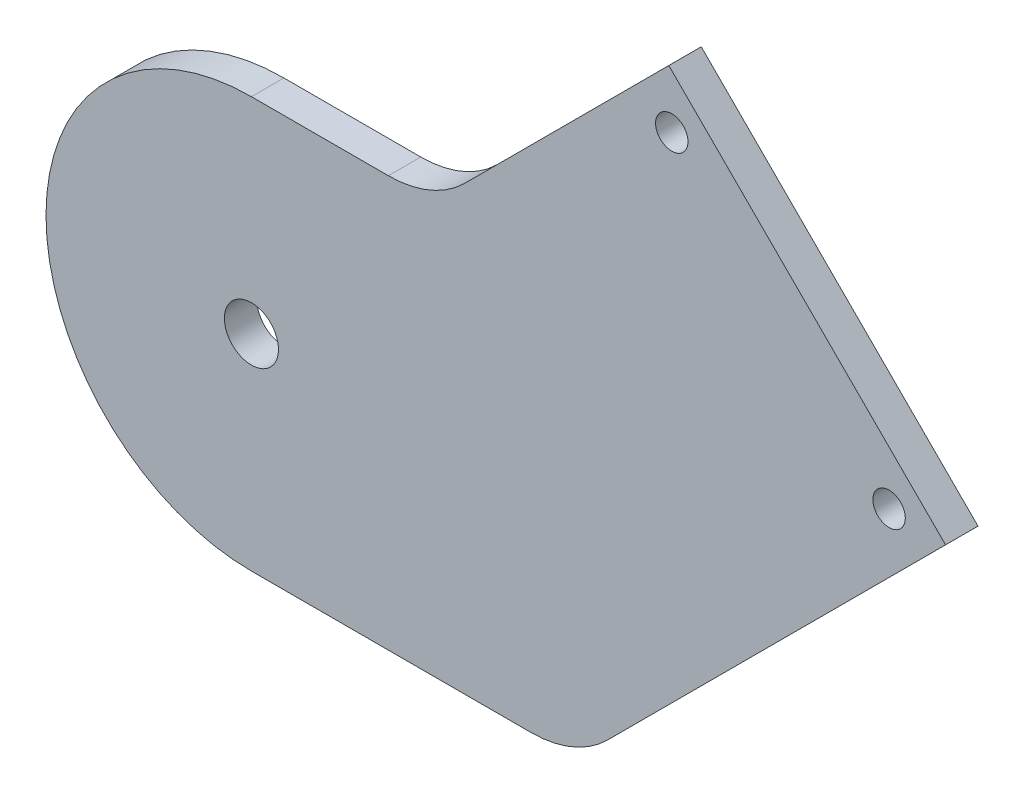
ISO-10303-21;
HEADER;
FILE_DESCRIPTION(('STEP AP214'),'2;1');
FILE_NAME('part.step','',(''),(''),'','','');
FILE_SCHEMA(('AUTOMOTIVE_DESIGN { 1 0 10303 214 1 1 1 1 }'));
ENDSEC;
DATA;
#1=APPLICATION_CONTEXT('core data for automotive mechanical design processes');
#2=APPLICATION_PROTOCOL_DEFINITION('international standard','automotive_design',2000,#1);
#3=PRODUCT_CONTEXT('',#1,'mechanical');
#4=PRODUCT('Part','Part','',(#3));
#5=PRODUCT_RELATED_PRODUCT_CATEGORY('part','',(#4));
#6=PRODUCT_DEFINITION_FORMATION('','',#4);
#7=PRODUCT_DEFINITION_CONTEXT('part definition',#1,'design');
#8=PRODUCT_DEFINITION('design','',#6,#7);
#9=PRODUCT_DEFINITION_SHAPE('','',#8);
#10=(LENGTH_UNIT() NAMED_UNIT(*) SI_UNIT(.MILLI.,.METRE.));
#11=(NAMED_UNIT(*) PLANE_ANGLE_UNIT() SI_UNIT($,.RADIAN.));
#12=(NAMED_UNIT(*) SI_UNIT($,.STERADIAN.) SOLID_ANGLE_UNIT());
#13=UNCERTAINTY_MEASURE_WITH_UNIT(LENGTH_MEASURE(1.E-05),#10,'distance_accuracy_value','');
#14=(GEOMETRIC_REPRESENTATION_CONTEXT(3) GLOBAL_UNCERTAINTY_ASSIGNED_CONTEXT((#13)) GLOBAL_UNIT_ASSIGNED_CONTEXT((#10,
#11,#12)) REPRESENTATION_CONTEXT('',''));
#15=CARTESIAN_POINT('',(0.,0.,0.));
#16=DIRECTION('',(0.,0.,1.));
#17=DIRECTION('',(1.,0.,0.));
#18=AXIS2_PLACEMENT_3D('',#15,#16,#17);
#19=CARTESIAN_POINT('',(0.,0.,3.));
#20=DIRECTION('',(0.,0.,1.));
#21=DIRECTION('',(1.,0.,0.));
#22=AXIS2_PLACEMENT_3D('',#19,#20,#21);
#23=PLANE('',#22);
#24=CARTESIAN_POINT('',(58.9776159145075,15.4753711382333,3.));
#25=DIRECTION('',(0.,0.,1.));
#26=DIRECTION('',(1.,0.,0.));
#27=AXIS2_PLACEMENT_3D('',#24,#25,#26);
#28=CIRCLE('',#27,1.5);
#29=CARTESIAN_POINT('',(60.4776159145075,15.4753711382333,3.));
#30=VERTEX_POINT('',#29);
#31=EDGE_CURVE('E197',#30,#30,#28,.T.);
#32=ORIENTED_EDGE('',*,*,#31,.F.);
#33=EDGE_LOOP('',(#32));
#34=FACE_BOUND('',#33,.T.);
#35=CARTESIAN_POINT('',(38.8781056592798,35.5748813934608,3.));
#36=DIRECTION('',(0.,0.,1.));
#37=DIRECTION('',(1.,0.,0.));
#38=AXIS2_PLACEMENT_3D('',#35,#36,#37);
#39=CIRCLE('',#38,1.5);
#40=CARTESIAN_POINT('',(40.3781056592798,35.5748813934608,3.));
#41=VERTEX_POINT('',#40);
#42=EDGE_CURVE('E191',#41,#41,#39,.T.);
#43=ORIENTED_EDGE('',*,*,#42,.F.);
#44=EDGE_LOOP('',(#43));
#45=FACE_BOUND('',#44,.T.);
#46=DIRECTION('',(1.,0.,0.));
#47=VECTOR('',#46,1.);
#48=CARTESIAN_POINT('',(0.,-19.,3.));
#49=LINE('',#48,#47);
#50=CARTESIAN_POINT('',(0.,-19.,3.));
#51=VERTEX_POINT('',#50);
#52=CARTESIAN_POINT('',(25.8578643762693,-19.0000000000004,3.));
#53=VERTEX_POINT('',#52);
#54=EDGE_CURVE('E98',#51,#53,#49,.T.);
#55=ORIENTED_EDGE('',*,*,#54,.T.);
#56=CARTESIAN_POINT('',(25.8578643762695,-9.00000000000041,3.));
#57=DIRECTION('',(0.,0.,1.));
#58=DIRECTION('',(1.,0.,0.));
#59=AXIS2_PLACEMENT_3D('',#56,#57,#58);
#60=CIRCLE('',#59,10.);
#61=CARTESIAN_POINT('',(32.9289321881351,-16.0710678118657,3.));
#62=VERTEX_POINT('',#61);
#63=EDGE_CURVE('E138',#53,#62,#60,.T.);
#64=ORIENTED_EDGE('',*,*,#63,.T.);
#65=DIRECTION('',(0.707106781186534,0.707106781186562,0.));
#66=VECTOR('',#65,1.);
#67=CARTESIAN_POINT('',(30.0000000000005,-19.0000000000005,3.));
#68=LINE('',#67,#66);
#69=CARTESIAN_POINT('',(64.2013672605232,15.2013672605235,3.));
#70=VERTEX_POINT('',#69);
#71=EDGE_CURVE('E106',#62,#70,#68,.T.);
#72=ORIENTED_EDGE('',*,*,#71,.T.);
#73=DIRECTION('',(-0.707106781186553,0.707106781186542,0.));
#74=VECTOR('',#73,1.);
#75=CARTESIAN_POINT('',(64.2013672605232,15.2013672605235,3.));
#76=LINE('',#75,#74);
#77=CARTESIAN_POINT('',(38.60410178157,40.7986327394764,3.));
#78=VERTEX_POINT('',#77);
#79=EDGE_CURVE('E165',#70,#78,#76,.T.);
#80=ORIENTED_EDGE('',*,*,#79,.T.);
#81=DIRECTION('',(-0.707106781186559,-0.707106781186536,0.));
#82=VECTOR('',#81,1.);
#83=CARTESIAN_POINT('',(38.60410178157,40.7986327394764,3.));
#84=LINE('',#83,#82);
#85=CARTESIAN_POINT('',(19.7344012302274,21.9289321881344,3.));
#86=VERTEX_POINT('',#85);
#87=EDGE_CURVE('E159',#78,#86,#84,.T.);
#88=ORIENTED_EDGE('',*,*,#87,.T.);
#89=CARTESIAN_POINT('',(12.663333418362,29.,3.));
#90=DIRECTION('',(0.,0.,1.));
#91=DIRECTION('',(1.,0.,0.));
#92=AXIS2_PLACEMENT_3D('',#89,#90,#91);
#93=CIRCLE('',#92,10.);
#94=CARTESIAN_POINT('',(12.663333418362,19.,3.));
#95=VERTEX_POINT('',#94);
#96=EDGE_CURVE('E11',#86,#95,#93,.F.);
#97=ORIENTED_EDGE('',*,*,#96,.T.);
#98=DIRECTION('',(-1.,0.,0.));
#99=VECTOR('',#98,1.);
#100=CARTESIAN_POINT('',(16.8054690420928,19.,3.));
#101=LINE('',#100,#99);
#102=CARTESIAN_POINT('',(0.,19.,3.));
#103=VERTEX_POINT('',#102);
#104=EDGE_CURVE('E112',#95,#103,#101,.T.);
#105=ORIENTED_EDGE('',*,*,#104,.T.);
#106=CARTESIAN_POINT('',(0.,0.,3.));
#107=DIRECTION('',(0.,0.,1.));
#108=DIRECTION('',(1.,0.,0.));
#109=AXIS2_PLACEMENT_3D('',#106,#107,#108);
#110=CIRCLE('',#109,19.);
#111=EDGE_CURVE('E107',#103,#51,#110,.T.);
#112=ORIENTED_EDGE('',*,*,#111,.T.);
#113=EDGE_LOOP('',(#55,#64,#72,#80,#88,#97,#105,#112));
#114=FACE_BOUND('',#113,.T.);
#115=CARTESIAN_POINT('',(0.,0.,3.));
#116=DIRECTION('',(0.,0.,1.));
#117=DIRECTION('',(1.,0.,0.));
#118=AXIS2_PLACEMENT_3D('',#115,#116,#117);
#119=CIRCLE('',#118,2.5);
#120=CARTESIAN_POINT('',(2.5,0.,3.));
#121=VERTEX_POINT('',#120);
#122=EDGE_CURVE('E171',#121,#121,#119,.T.);
#123=ORIENTED_EDGE('',*,*,#122,.F.);
#124=EDGE_LOOP('',(#123));
#125=FACE_BOUND('',#124,.T.);
#126=ADVANCED_FACE('F36',(#34,#45,#114,#125),#23,.T.);
#127=CARTESIAN_POINT('',(0.,0.,0.));
#128=DIRECTION('',(0.,0.,1.));
#129=DIRECTION('',(1.,0.,0.));
#130=AXIS2_PLACEMENT_3D('',#127,#128,#129);
#131=PLANE('',#130);
#132=CARTESIAN_POINT('',(58.9776159145075,15.4753711382333,0.));
#133=DIRECTION('',(0.,0.,1.));
#134=DIRECTION('',(1.,0.,0.));
#135=AXIS2_PLACEMENT_3D('',#132,#133,#134);
#136=CIRCLE('',#135,1.5);
#137=CARTESIAN_POINT('',(60.4776159145075,15.4753711382333,0.));
#138=VERTEX_POINT('',#137);
#139=EDGE_CURVE('E194',#138,#138,#136,.T.);
#140=ORIENTED_EDGE('',*,*,#139,.T.);
#141=EDGE_LOOP('',(#140));
#142=FACE_BOUND('',#141,.T.);
#143=CARTESIAN_POINT('',(38.8781056592798,35.5748813934608,0.));
#144=DIRECTION('',(0.,0.,1.));
#145=DIRECTION('',(1.,0.,0.));
#146=AXIS2_PLACEMENT_3D('',#143,#144,#145);
#147=CIRCLE('',#146,1.5);
#148=CARTESIAN_POINT('',(40.3781056592798,35.5748813934608,0.));
#149=VERTEX_POINT('',#148);
#150=EDGE_CURVE('E188',#149,#149,#147,.T.);
#151=ORIENTED_EDGE('',*,*,#150,.T.);
#152=EDGE_LOOP('',(#151));
#153=FACE_BOUND('',#152,.T.);
#154=DIRECTION('',(0.707106781186534,0.707106781186562,0.));
#155=VECTOR('',#154,1.);
#156=CARTESIAN_POINT('',(30.0000000000005,-19.0000000000005,0.));
#157=LINE('',#156,#155);
#158=CARTESIAN_POINT('',(32.9289321881351,-16.0710678118657,0.));
#159=VERTEX_POINT('',#158);
#160=CARTESIAN_POINT('',(64.2013672605232,15.2013672605235,0.));
#161=VERTEX_POINT('',#160);
#162=EDGE_CURVE('E173',#159,#161,#157,.T.);
#163=ORIENTED_EDGE('',*,*,#162,.F.);
#164=CARTESIAN_POINT('',(25.8578643762695,-9.00000000000041,0.));
#165=DIRECTION('',(0.,0.,1.));
#166=DIRECTION('',(1.,0.,0.));
#167=AXIS2_PLACEMENT_3D('',#164,#165,#166);
#168=CIRCLE('',#167,10.);
#169=CARTESIAN_POINT('',(25.8578643762693,-19.0000000000004,0.));
#170=VERTEX_POINT('',#169);
#171=EDGE_CURVE('E59',#159,#170,#168,.F.);
#172=ORIENTED_EDGE('',*,*,#171,.T.);
#173=DIRECTION('',(1.,0.,0.));
#174=VECTOR('',#173,1.);
#175=CARTESIAN_POINT('',(0.,-19.,0.));
#176=LINE('',#175,#174);
#177=CARTESIAN_POINT('',(0.,-19.,0.));
#178=VERTEX_POINT('',#177);
#179=EDGE_CURVE('E170',#178,#170,#176,.T.);
#180=ORIENTED_EDGE('',*,*,#179,.F.);
#181=CARTESIAN_POINT('',(0.,0.,0.));
#182=DIRECTION('',(0.,0.,1.));
#183=DIRECTION('',(1.,0.,0.));
#184=AXIS2_PLACEMENT_3D('',#181,#182,#183);
#185=CIRCLE('',#184,19.);
#186=CARTESIAN_POINT('',(0.,19.,0.));
#187=VERTEX_POINT('',#186);
#188=EDGE_CURVE('E120',#187,#178,#185,.T.);
#189=ORIENTED_EDGE('',*,*,#188,.F.);
#190=DIRECTION('',(-1.,0.,0.));
#191=VECTOR('',#190,1.);
#192=CARTESIAN_POINT('',(16.8054690420928,19.,0.));
#193=LINE('',#192,#191);
#194=CARTESIAN_POINT('',(12.663333418362,19.,0.));
#195=VERTEX_POINT('',#194);
#196=EDGE_CURVE('E116',#195,#187,#193,.T.);
#197=ORIENTED_EDGE('',*,*,#196,.F.);
#198=CARTESIAN_POINT('',(12.663333418362,29.,0.));
#199=DIRECTION('',(0.,0.,1.));
#200=DIRECTION('',(1.,0.,0.));
#201=AXIS2_PLACEMENT_3D('',#198,#199,#200);
#202=CIRCLE('',#201,10.);
#203=CARTESIAN_POINT('',(19.7344012302274,21.9289321881344,0.));
#204=VERTEX_POINT('',#203);
#205=EDGE_CURVE('E44',#195,#204,#202,.T.);
#206=ORIENTED_EDGE('',*,*,#205,.T.);
#207=DIRECTION('',(-0.707106781186559,-0.707106781186536,0.));
#208=VECTOR('',#207,1.);
#209=CARTESIAN_POINT('',(38.60410178157,40.7986327394764,0.));
#210=LINE('',#209,#208);
#211=CARTESIAN_POINT('',(38.60410178157,40.7986327394764,0.));
#212=VERTEX_POINT('',#211);
#213=EDGE_CURVE('E145',#212,#204,#210,.T.);
#214=ORIENTED_EDGE('',*,*,#213,.F.);
#215=DIRECTION('',(-0.70710678118655,0.707106781186545,0.));
#216=VECTOR('',#215,1.);
#217=CARTESIAN_POINT('',(44.1902453529437,35.2124891681027,0.));
#218=LINE('',#217,#216);
#219=EDGE_CURVE('E155',#161,#212,#218,.T.);
#220=ORIENTED_EDGE('',*,*,#219,.F.);
#221=EDGE_LOOP('',(#163,#172,#180,#189,#197,#206,#214,#220));
#222=FACE_BOUND('',#221,.T.);
#223=CARTESIAN_POINT('',(0.,0.,0.));
#224=DIRECTION('',(0.,0.,1.));
#225=DIRECTION('',(1.,0.,0.));
#226=AXIS2_PLACEMENT_3D('',#223,#224,#225);
#227=CIRCLE('',#226,2.5);
#228=CARTESIAN_POINT('',(2.5,0.,0.));
#229=VERTEX_POINT('',#228);
#230=EDGE_CURVE('E185',#229,#229,#227,.T.);
#231=ORIENTED_EDGE('',*,*,#230,.T.);
#232=EDGE_LOOP('',(#231));
#233=FACE_BOUND('',#232,.T.);
#234=ADVANCED_FACE('F142',(#142,#153,#222,#233),#131,.F.);
#235=CARTESIAN_POINT('',(0.,0.,3.));
#236=DIRECTION('',(0.,0.,-1.));
#237=DIRECTION('',(-1.,0.,0.));
#238=AXIS2_PLACEMENT_3D('',#235,#236,#237);
#239=CYLINDRICAL_SURFACE('',#238,19.);
#240=ORIENTED_EDGE('',*,*,#188,.T.);
#241=DIRECTION('',(0.,0.,-1.));
#242=VECTOR('',#241,1.);
#243=CARTESIAN_POINT('',(0.,-19.,3.));
#244=LINE('',#243,#242);
#245=EDGE_CURVE('E102',#51,#178,#244,.T.);
#246=ORIENTED_EDGE('',*,*,#245,.F.);
#247=ORIENTED_EDGE('',*,*,#111,.F.);
#248=DIRECTION('',(0.,0.,-1.));
#249=VECTOR('',#248,1.);
#250=CARTESIAN_POINT('',(0.,19.,3.));
#251=LINE('',#250,#249);
#252=EDGE_CURVE('E162',#103,#187,#251,.T.);
#253=ORIENTED_EDGE('',*,*,#252,.T.);
#254=EDGE_LOOP('',(#240,#246,#247,#253));
#255=FACE_BOUND('',#254,.T.);
#256=ADVANCED_FACE('F118',(#255),#239,.T.);
#257=CARTESIAN_POINT('',(0.,-19.,3.));
#258=DIRECTION('',(0.,1.,0.));
#259=DIRECTION('',(-1.,0.,0.));
#260=AXIS2_PLACEMENT_3D('',#257,#258,#259);
#261=PLANE('',#260);
#262=ORIENTED_EDGE('',*,*,#179,.T.);
#263=DIRECTION('',(0.,0.,-1.));
#264=VECTOR('',#263,1.);
#265=CARTESIAN_POINT('',(25.8578643762693,-19.0000000000004,3.));
#266=LINE('',#265,#264);
#267=EDGE_CURVE('E51',#170,#53,#266,.F.);
#268=ORIENTED_EDGE('',*,*,#267,.T.);
#269=ORIENTED_EDGE('',*,*,#54,.F.);
#270=ORIENTED_EDGE('',*,*,#245,.T.);
#271=EDGE_LOOP('',(#262,#268,#269,#270));
#272=FACE_BOUND('',#271,.T.);
#273=ADVANCED_FACE('F100',(#272),#261,.F.);
#274=CARTESIAN_POINT('',(30.0000000000005,-19.0000000000005,3.));
#275=DIRECTION('',(-0.707106781186561,0.707106781186533,0.));
#276=DIRECTION('',(-0.707106781186534,-0.707106781186562,0.));
#277=AXIS2_PLACEMENT_3D('',#274,#275,#276);
#278=PLANE('',#277);
#279=ORIENTED_EDGE('',*,*,#71,.F.);
#280=DIRECTION('',(0.,0.,-1.));
#281=VECTOR('',#280,1.);
#282=CARTESIAN_POINT('',(32.9289321881351,-16.0710678118657,3.));
#283=LINE('',#282,#281);
#284=EDGE_CURVE('E133',#62,#159,#283,.T.);
#285=ORIENTED_EDGE('',*,*,#284,.T.);
#286=ORIENTED_EDGE('',*,*,#162,.T.);
#287=DIRECTION('',(0.,0.,-1.));
#288=VECTOR('',#287,1.);
#289=CARTESIAN_POINT('',(64.2013672605232,15.2013672605235,3.));
#290=LINE('',#289,#288);
#291=EDGE_CURVE('E122',#70,#161,#290,.T.);
#292=ORIENTED_EDGE('',*,*,#291,.F.);
#293=EDGE_LOOP('',(#279,#285,#286,#292));
#294=FACE_BOUND('',#293,.T.);
#295=ADVANCED_FACE('F181',(#294),#278,.F.);
#296=CARTESIAN_POINT('',(44.1902453529437,35.2124891681027,3.));
#297=DIRECTION('',(-0.707106781186545,-0.70710678118655,0.));
#298=DIRECTION('',(0.70710678118655,-0.707106781186545,0.));
#299=AXIS2_PLACEMENT_3D('',#296,#297,#298);
#300=PLANE('',#299);
#301=ORIENTED_EDGE('',*,*,#219,.T.);
#302=DIRECTION('',(0.,0.,-1.));
#303=VECTOR('',#302,1.);
#304=CARTESIAN_POINT('',(38.60410178157,40.7986327394764,3.));
#305=LINE('',#304,#303);
#306=EDGE_CURVE('E128',#78,#212,#305,.T.);
#307=ORIENTED_EDGE('',*,*,#306,.F.);
#308=ORIENTED_EDGE('',*,*,#79,.F.);
#309=ORIENTED_EDGE('',*,*,#291,.T.);
#310=EDGE_LOOP('',(#301,#307,#308,#309));
#311=FACE_BOUND('',#310,.T.);
#312=ADVANCED_FACE('F234',(#311),#300,.F.);
#313=CARTESIAN_POINT('',(38.60410178157,40.7986327394764,3.));
#314=DIRECTION('',(0.707106781186536,-0.707106781186559,0.));
#315=DIRECTION('',(0.707106781186559,0.707106781186536,0.));
#316=AXIS2_PLACEMENT_3D('',#313,#314,#315);
#317=PLANE('',#316);
#318=ORIENTED_EDGE('',*,*,#213,.T.);
#319=DIRECTION('',(0.,0.,-1.));
#320=VECTOR('',#319,1.);
#321=CARTESIAN_POINT('',(19.7344012302274,21.9289321881344,3.));
#322=LINE('',#321,#320);
#323=EDGE_CURVE('E125',#204,#86,#322,.F.);
#324=ORIENTED_EDGE('',*,*,#323,.T.);
#325=ORIENTED_EDGE('',*,*,#87,.F.);
#326=ORIENTED_EDGE('',*,*,#306,.T.);
#327=EDGE_LOOP('',(#318,#324,#325,#326));
#328=FACE_BOUND('',#327,.T.);
#329=ADVANCED_FACE('F151',(#328),#317,.F.);
#330=CARTESIAN_POINT('',(16.8054690420928,19.,3.));
#331=DIRECTION('',(0.,-1.,0.));
#332=DIRECTION('',(0.,0.,-1.));
#333=AXIS2_PLACEMENT_3D('',#330,#331,#332);
#334=PLANE('',#333);
#335=ORIENTED_EDGE('',*,*,#104,.F.);
#336=DIRECTION('',(0.,0.,-1.));
#337=VECTOR('',#336,1.);
#338=CARTESIAN_POINT('',(12.663333418362,19.,0.));
#339=LINE('',#338,#337);
#340=EDGE_CURVE('E121',#95,#195,#339,.T.);
#341=ORIENTED_EDGE('',*,*,#340,.T.);
#342=ORIENTED_EDGE('',*,*,#196,.T.);
#343=ORIENTED_EDGE('',*,*,#252,.F.);
#344=EDGE_LOOP('',(#335,#341,#342,#343));
#345=FACE_BOUND('',#344,.T.);
#346=ADVANCED_FACE('F161',(#345),#334,.F.);
#347=CARTESIAN_POINT('',(0.,0.,3.));
#348=DIRECTION('',(0.,0.,-1.));
#349=DIRECTION('',(-1.,0.,0.));
#350=AXIS2_PLACEMENT_3D('',#347,#348,#349);
#351=CYLINDRICAL_SURFACE('',#350,2.5);
#352=ORIENTED_EDGE('',*,*,#122,.T.);
#353=EDGE_LOOP('',(#352));
#354=FACE_BOUND('',#353,.T.);
#355=ORIENTED_EDGE('',*,*,#230,.F.);
#356=EDGE_LOOP('',(#355));
#357=FACE_BOUND('',#356,.T.);
#358=ADVANCED_FACE('F218',(#354,#357),#351,.F.);
#359=CARTESIAN_POINT('',(38.8781056592798,35.5748813934608,0.));
#360=DIRECTION('',(0.,0.,1.));
#361=DIRECTION('',(1.,0.,0.));
#362=AXIS2_PLACEMENT_3D('',#359,#360,#361);
#363=CYLINDRICAL_SURFACE('',#362,1.5);
#364=ORIENTED_EDGE('',*,*,#150,.F.);
#365=EDGE_LOOP('',(#364));
#366=FACE_BOUND('',#365,.T.);
#367=ORIENTED_EDGE('',*,*,#42,.T.);
#368=EDGE_LOOP('',(#367));
#369=FACE_BOUND('',#368,.T.);
#370=ADVANCED_FACE('F208',(#366,#369),#363,.F.);
#371=CARTESIAN_POINT('',(58.9776159145075,15.4753711382333,0.));
#372=DIRECTION('',(0.,0.,1.));
#373=DIRECTION('',(1.,0.,0.));
#374=AXIS2_PLACEMENT_3D('',#371,#372,#373);
#375=CYLINDRICAL_SURFACE('',#374,1.5);
#376=ORIENTED_EDGE('',*,*,#139,.F.);
#377=EDGE_LOOP('',(#376));
#378=FACE_BOUND('',#377,.T.);
#379=ORIENTED_EDGE('',*,*,#31,.T.);
#380=EDGE_LOOP('',(#379));
#381=FACE_BOUND('',#380,.T.);
#382=ADVANCED_FACE('F205',(#378,#381),#375,.F.);
#383=CARTESIAN_POINT('',(12.663333418362,29.,3.));
#384=DIRECTION('',(0.,0.,1.));
#385=DIRECTION('',(1.,0.,0.));
#386=AXIS2_PLACEMENT_3D('',#383,#384,#385);
#387=CYLINDRICAL_SURFACE('',#386,10.);
#388=ORIENTED_EDGE('',*,*,#96,.F.);
#389=ORIENTED_EDGE('',*,*,#323,.F.);
#390=ORIENTED_EDGE('',*,*,#205,.F.);
#391=ORIENTED_EDGE('',*,*,#340,.F.);
#392=EDGE_LOOP('',(#388,#389,#390,#391));
#393=FACE_BOUND('',#392,.T.);
#394=ADVANCED_FACE('F158',(#393),#387,.F.);
#395=CARTESIAN_POINT('',(25.8578643762695,-9.00000000000041,3.));
#396=DIRECTION('',(0.,0.,-1.));
#397=DIRECTION('',(-1.,0.,0.));
#398=AXIS2_PLACEMENT_3D('',#395,#396,#397);
#399=CYLINDRICAL_SURFACE('',#398,10.);
#400=ORIENTED_EDGE('',*,*,#63,.F.);
#401=ORIENTED_EDGE('',*,*,#267,.F.);
#402=ORIENTED_EDGE('',*,*,#171,.F.);
#403=ORIENTED_EDGE('',*,*,#284,.F.);
#404=EDGE_LOOP('',(#400,#401,#402,#403));
#405=FACE_BOUND('',#404,.T.);
#406=ADVANCED_FACE('F38',(#405),#399,.T.);
#407=CLOSED_SHELL('',(#126,#234,#256,#273,#295,#312,#329,#346,#358,#370,#382,#394,#406));
#408=MANIFOLD_SOLID_BREP('B2',#407);
#409=ADVANCED_BREP_SHAPE_REPRESENTATION('',(#18,#408),#14);
#410=SHAPE_DEFINITION_REPRESENTATION(#9,#409);
ENDSEC;
END-ISO-10303-21;
